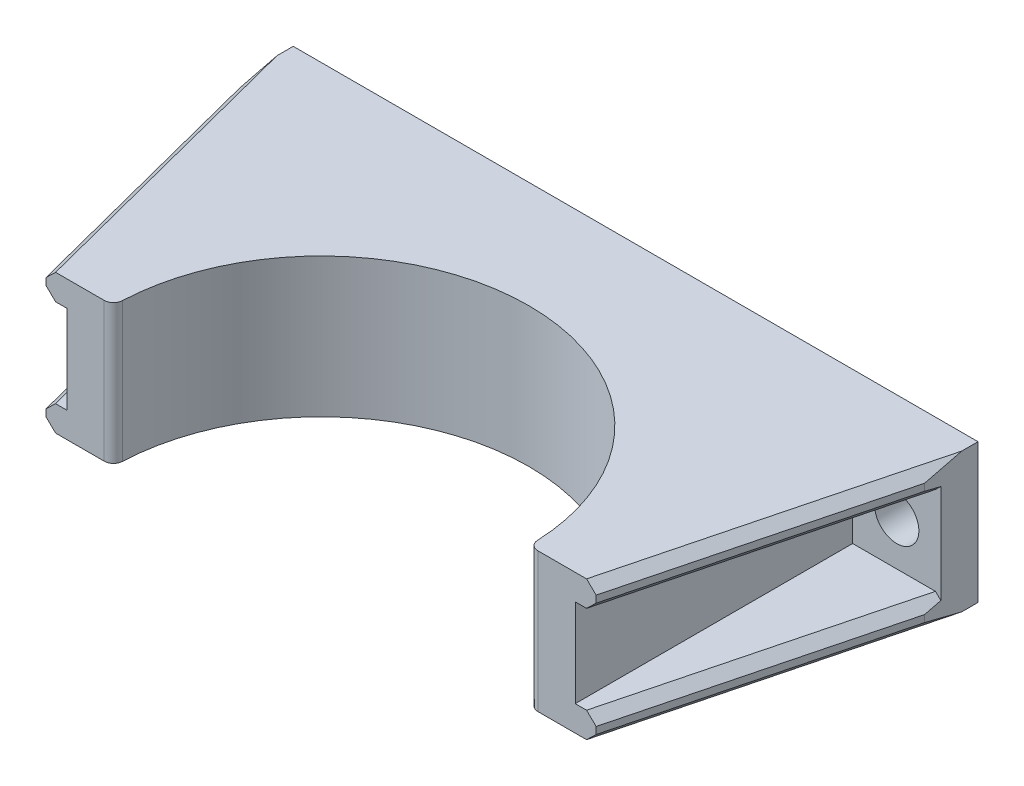
ISO-10303-21;
HEADER;
FILE_DESCRIPTION(('STEP AP214'),'2;1');
FILE_NAME('part.step','',(''),(''),'','','');
FILE_SCHEMA(('AUTOMOTIVE_DESIGN { 1 0 10303 214 1 1 1 1 }'));
ENDSEC;
DATA;
#1=APPLICATION_CONTEXT('core data for automotive mechanical design processes');
#2=APPLICATION_PROTOCOL_DEFINITION('international standard','automotive_design',2000,#1);
#3=PRODUCT_CONTEXT('',#1,'mechanical');
#4=PRODUCT('Part','Part','',(#3));
#5=PRODUCT_RELATED_PRODUCT_CATEGORY('part','',(#4));
#6=PRODUCT_DEFINITION_FORMATION('','',#4);
#7=PRODUCT_DEFINITION_CONTEXT('part definition',#1,'design');
#8=PRODUCT_DEFINITION('design','',#6,#7);
#9=PRODUCT_DEFINITION_SHAPE('','',#8);
#10=(LENGTH_UNIT() NAMED_UNIT(*) SI_UNIT(.MILLI.,.METRE.));
#11=(NAMED_UNIT(*) PLANE_ANGLE_UNIT() SI_UNIT($,.RADIAN.));
#12=(NAMED_UNIT(*) SI_UNIT($,.STERADIAN.) SOLID_ANGLE_UNIT());
#13=UNCERTAINTY_MEASURE_WITH_UNIT(LENGTH_MEASURE(1.E-05),#10,'distance_accuracy_value','');
#14=(GEOMETRIC_REPRESENTATION_CONTEXT(3) GLOBAL_UNCERTAINTY_ASSIGNED_CONTEXT((#13)) GLOBAL_UNIT_ASSIGNED_CONTEXT((#10,
#11,#12)) REPRESENTATION_CONTEXT('',''));
#15=CARTESIAN_POINT('',(0.,0.,0.));
#16=DIRECTION('',(0.,0.,1.));
#17=DIRECTION('',(1.,0.,0.));
#18=AXIS2_PLACEMENT_3D('',#15,#16,#17);
#19=CARTESIAN_POINT('',(54.75,30.,11.5));
#20=DIRECTION('',(-1.,0.,0.));
#21=DIRECTION('',(0.,0.,1.));
#22=AXIS2_PLACEMENT_3D('',#19,#20,#21);
#23=PLANE('',#22);
#24=DIRECTION('',(0.,0.,-1.));
#25=VECTOR('',#24,1.);
#26=CARTESIAN_POINT('',(54.75,5.49999999999998,76.0300404448525));
#27=LINE('',#26,#25);
#28=CARTESIAN_POINT('',(54.75,5.49999999999998,56.25));
#29=VERTEX_POINT('',#28);
#30=CARTESIAN_POINT('',(54.75,5.49999999999998,-3.5));
#31=VERTEX_POINT('',#30);
#32=EDGE_CURVE('E353',#29,#31,#27,.T.);
#33=ORIENTED_EDGE('',*,*,#32,.T.);
#34=DIRECTION('',(0.,-1.,0.));
#35=VECTOR('',#34,1.);
#36=CARTESIAN_POINT('',(54.75,30.,-3.5));
#37=LINE('',#36,#35);
#38=CARTESIAN_POINT('',(54.75,24.5,-3.50000000000001));
#39=VERTEX_POINT('',#38);
#40=EDGE_CURVE('E254',#39,#31,#37,.T.);
#41=ORIENTED_EDGE('',*,*,#40,.F.);
#42=DIRECTION('',(0.,0.,-1.));
#43=VECTOR('',#42,1.);
#44=CARTESIAN_POINT('',(54.75,24.5,76.0300404448525));
#45=LINE('',#44,#43);
#46=CARTESIAN_POINT('',(54.75,24.5,56.25));
#47=VERTEX_POINT('',#46);
#48=EDGE_CURVE('E239',#47,#39,#45,.T.);
#49=ORIENTED_EDGE('',*,*,#48,.F.);
#50=DIRECTION('',(0.,-1.,0.));
#51=VECTOR('',#50,1.);
#52=CARTESIAN_POINT('',(54.75,30.,56.25));
#53=LINE('',#52,#51);
#54=EDGE_CURVE('E251',#47,#29,#53,.T.);
#55=ORIENTED_EDGE('',*,*,#54,.T.);
#56=EDGE_LOOP('',(#33,#41,#49,#55));
#57=FACE_BOUND('',#56,.T.);
#58=ADVANCED_FACE('F47',(#57),#23,.F.);
#59=CARTESIAN_POINT('',(54.75,30.,-3.5));
#60=DIRECTION('',(0.,0.,-1.));
#61=DIRECTION('',(-1.,0.,0.));
#62=AXIS2_PLACEMENT_3D('',#59,#60,#61);
#63=PLANE('',#62);
#64=CARTESIAN_POINT('',(64.25,15.,-3.5));
#65=DIRECTION('',(0.,0.,-1.));
#66=DIRECTION('',(-1.,0.,0.));
#67=AXIS2_PLACEMENT_3D('',#64,#65,#66);
#68=CIRCLE('',#67,4.7625);
#69=CARTESIAN_POINT('',(59.4875,15.,-3.5));
#70=VERTEX_POINT('',#69);
#71=EDGE_CURVE('E286',#70,#70,#68,.T.);
#72=ORIENTED_EDGE('',*,*,#71,.T.);
#73=EDGE_LOOP('',(#72));
#74=FACE_BOUND('',#73,.T.);
#75=DIRECTION('',(-1.,0.,0.));
#76=VECTOR('',#75,1.);
#77=CARTESIAN_POINT('',(73.75,5.49999999999998,-3.50000000000001));
#78=LINE('',#77,#76);
#79=CARTESIAN_POINT('',(72.5868414992406,5.49999999999998,-3.50000000000001));
#80=VERTEX_POINT('',#79);
#81=EDGE_CURVE('E246',#80,#31,#78,.T.);
#82=ORIENTED_EDGE('',*,*,#81,.F.);
#83=DIRECTION('',(-0.718385797448398,0.695644913748695,0.));
#84=VECTOR('',#83,1.);
#85=CARTESIAN_POINT('',(51.1379723260028,26.269893835625,-3.5));
#86=LINE('',#85,#84);
#87=CARTESIAN_POINT('',(73.75,4.37366189892556,-3.5));
#88=VERTEX_POINT('',#87);
#89=EDGE_CURVE('E410',#80,#88,#86,.F.);
#90=ORIENTED_EDGE('',*,*,#89,.T.);
#91=DIRECTION('',(0.,-1.,0.));
#92=VECTOR('',#91,1.);
#93=CARTESIAN_POINT('',(73.75,30.,-3.5));
#94=LINE('',#93,#92);
#95=CARTESIAN_POINT('',(73.75,25.6263381010744,-3.5));
#96=VERTEX_POINT('',#95);
#97=EDGE_CURVE('E271',#96,#88,#94,.T.);
#98=ORIENTED_EDGE('',*,*,#97,.F.);
#99=DIRECTION('',(0.718385797448397,0.695644913748696,0.));
#100=VECTOR('',#99,1.);
#101=CARTESIAN_POINT('',(66.1302151091312,18.2477615451079,-3.5));
#102=LINE('',#101,#100);
#103=CARTESIAN_POINT('',(72.5868414992406,24.5,-3.50000000000001));
#104=VERTEX_POINT('',#103);
#105=EDGE_CURVE('E494',#96,#104,#102,.F.);
#106=ORIENTED_EDGE('',*,*,#105,.T.);
#107=DIRECTION('',(1.,0.,0.));
#108=VECTOR('',#107,1.);
#109=CARTESIAN_POINT('',(73.75,24.5,-3.50000000000001));
#110=LINE('',#109,#108);
#111=EDGE_CURVE('E256',#39,#104,#110,.T.);
#112=ORIENTED_EDGE('',*,*,#111,.F.);
#113=ORIENTED_EDGE('',*,*,#40,.T.);
#114=EDGE_LOOP('',(#82,#90,#98,#106,#112,#113));
#115=FACE_BOUND('',#114,.T.);
#116=ADVANCED_FACE('F403',(#74,#115),#63,.F.);
#117=CARTESIAN_POINT('',(-54.75,30.,-3.5));
#118=DIRECTION('',(0.,0.,-1.));
#119=DIRECTION('',(-1.,0.,0.));
#120=AXIS2_PLACEMENT_3D('',#117,#118,#119);
#121=PLANE('',#120);
#122=CARTESIAN_POINT('',(-64.25,15.,-3.5));
#123=DIRECTION('',(0.,0.,-1.));
#124=DIRECTION('',(-1.,0.,0.));
#125=AXIS2_PLACEMENT_3D('',#122,#123,#124);
#126=CIRCLE('',#125,4.7625);
#127=CARTESIAN_POINT('',(-69.0125,15.,-3.5));
#128=VERTEX_POINT('',#127);
#129=EDGE_CURVE('E290',#128,#128,#126,.T.);
#130=ORIENTED_EDGE('',*,*,#129,.T.);
#131=EDGE_LOOP('',(#130));
#132=FACE_BOUND('',#131,.T.);
#133=DIRECTION('',(-1.,0.,0.));
#134=VECTOR('',#133,1.);
#135=CARTESIAN_POINT('',(-73.75,5.49999999999999,-3.50000000000001));
#136=LINE('',#135,#134);
#137=CARTESIAN_POINT('',(-54.75,5.49999999999999,-3.5));
#138=VERTEX_POINT('',#137);
#139=CARTESIAN_POINT('',(-72.5868414992405,5.49999999999999,-3.50000000000001));
#140=VERTEX_POINT('',#139);
#141=EDGE_CURVE('E370',#138,#140,#136,.T.);
#142=ORIENTED_EDGE('',*,*,#141,.F.);
#143=DIRECTION('',(0.,-1.,0.));
#144=VECTOR('',#143,1.);
#145=CARTESIAN_POINT('',(-54.75,30.,-3.5));
#146=LINE('',#145,#144);
#147=CARTESIAN_POINT('',(-54.75,24.5,-3.50000000000001));
#148=VERTEX_POINT('',#147);
#149=EDGE_CURVE('E269',#148,#138,#146,.T.);
#150=ORIENTED_EDGE('',*,*,#149,.F.);
#151=DIRECTION('',(1.,0.,0.));
#152=VECTOR('',#151,1.);
#153=CARTESIAN_POINT('',(-73.75,24.5,-3.50000000000001));
#154=LINE('',#153,#152);
#155=CARTESIAN_POINT('',(-72.5868414992405,24.5,-3.50000000000001));
#156=VERTEX_POINT('',#155);
#157=EDGE_CURVE('E374',#156,#148,#154,.T.);
#158=ORIENTED_EDGE('',*,*,#157,.F.);
#159=DIRECTION('',(0.718385797448395,-0.695644913748697,0.));
#160=VECTOR('',#159,1.);
#161=CARTESIAN_POINT('',(-66.1302151091312,18.2477615451079,-3.5));
#162=LINE('',#161,#160);
#163=CARTESIAN_POINT('',(-73.75,25.6263381010744,-3.5));
#164=VERTEX_POINT('',#163);
#165=EDGE_CURVE('E502',#156,#164,#162,.F.);
#166=ORIENTED_EDGE('',*,*,#165,.T.);
#167=DIRECTION('',(0.,-1.,0.));
#168=VECTOR('',#167,1.);
#169=CARTESIAN_POINT('',(-73.75,30.,-3.5));
#170=LINE('',#169,#168);
#171=CARTESIAN_POINT('',(-73.75,4.37366189892556,-3.5));
#172=VERTEX_POINT('',#171);
#173=EDGE_CURVE('E278',#164,#172,#170,.T.);
#174=ORIENTED_EDGE('',*,*,#173,.T.);
#175=DIRECTION('',(-0.7183857974484,-0.695644913748693,0.));
#176=VECTOR('',#175,1.);
#177=CARTESIAN_POINT('',(-51.1379723260028,26.2698938356249,-3.5));
#178=LINE('',#177,#176);
#179=EDGE_CURVE('E499',#172,#140,#178,.F.);
#180=ORIENTED_EDGE('',*,*,#179,.T.);
#181=EDGE_LOOP('',(#142,#150,#158,#166,#174,#180));
#182=FACE_BOUND('',#181,.T.);
#183=ADVANCED_FACE('F406',(#132,#182),#121,.F.);
#184=CARTESIAN_POINT('',(-54.75,30.,11.5));
#185=DIRECTION('',(1.,0.,0.));
#186=DIRECTION('',(0.,0.,-1.));
#187=AXIS2_PLACEMENT_3D('',#184,#185,#186);
#188=PLANE('',#187);
#189=DIRECTION('',(0.,0.,-1.));
#190=VECTOR('',#189,1.);
#191=CARTESIAN_POINT('',(-54.75,5.49999999999999,76.0300404448525));
#192=LINE('',#191,#190);
#193=CARTESIAN_POINT('',(-54.75,5.49999999999999,56.25));
#194=VERTEX_POINT('',#193);
#195=EDGE_CURVE('E366',#194,#138,#192,.T.);
#196=ORIENTED_EDGE('',*,*,#195,.F.);
#197=DIRECTION('',(0.,-1.,0.));
#198=VECTOR('',#197,1.);
#199=CARTESIAN_POINT('',(-54.75,30.,56.25));
#200=LINE('',#199,#198);
#201=CARTESIAN_POINT('',(-54.75,24.5,56.25));
#202=VERTEX_POINT('',#201);
#203=EDGE_CURVE('E264',#202,#194,#200,.T.);
#204=ORIENTED_EDGE('',*,*,#203,.F.);
#205=DIRECTION('',(0.,0.,-1.));
#206=VECTOR('',#205,1.);
#207=CARTESIAN_POINT('',(-54.75,24.5,76.0300404448525));
#208=LINE('',#207,#206);
#209=EDGE_CURVE('E380',#202,#148,#208,.T.);
#210=ORIENTED_EDGE('',*,*,#209,.T.);
#211=ORIENTED_EDGE('',*,*,#149,.T.);
#212=EDGE_LOOP('',(#196,#204,#210,#211));
#213=FACE_BOUND('',#212,.T.);
#214=ADVANCED_FACE('F637',(#213),#188,.F.);
#215=CARTESIAN_POINT('',(-54.75,30.,-11.5));
#216=DIRECTION('',(0.,0.,1.));
#217=DIRECTION('',(1.,0.,0.));
#218=AXIS2_PLACEMENT_3D('',#215,#216,#217);
#219=PLANE('',#218);
#220=CARTESIAN_POINT('',(-64.25,15.,-11.5));
#221=DIRECTION('',(0.,0.,1.));
#222=DIRECTION('',(1.,0.,0.));
#223=AXIS2_PLACEMENT_3D('',#220,#221,#222);
#224=CIRCLE('',#223,4.7625);
#225=CARTESIAN_POINT('',(-59.4875,15.,-11.5));
#226=VERTEX_POINT('',#225);
#227=EDGE_CURVE('E291',#226,#226,#224,.T.);
#228=ORIENTED_EDGE('',*,*,#227,.T.);
#229=EDGE_LOOP('',(#228));
#230=FACE_BOUND('',#229,.T.);
#231=CARTESIAN_POINT('',(64.25,15.,-11.5));
#232=DIRECTION('',(0.,0.,1.));
#233=DIRECTION('',(1.,0.,0.));
#234=AXIS2_PLACEMENT_3D('',#231,#232,#233);
#235=CIRCLE('',#234,4.7625);
#236=CARTESIAN_POINT('',(69.0125,15.,-11.5));
#237=VERTEX_POINT('',#236);
#238=EDGE_CURVE('E379',#237,#237,#235,.T.);
#239=ORIENTED_EDGE('',*,*,#238,.T.);
#240=EDGE_LOOP('',(#239));
#241=FACE_BOUND('',#240,.T.);
#242=DIRECTION('',(-1.,0.,0.));
#243=VECTOR('',#242,1.);
#244=CARTESIAN_POINT('',(-54.75,0.,-11.5));
#245=LINE('',#244,#243);
#246=CARTESIAN_POINT('',(73.75,0.,-11.5));
#247=VERTEX_POINT('',#246);
#248=CARTESIAN_POINT('',(-73.75,0.,-11.5));
#249=VERTEX_POINT('',#248);
#250=EDGE_CURVE('E295',#247,#249,#245,.T.);
#251=ORIENTED_EDGE('',*,*,#250,.T.);
#252=DIRECTION('',(0.,-1.,0.));
#253=VECTOR('',#252,1.);
#254=CARTESIAN_POINT('',(-73.75,30.,-11.5));
#255=LINE('',#254,#253);
#256=CARTESIAN_POINT('',(-73.75,30.,-11.5));
#257=VERTEX_POINT('',#256);
#258=EDGE_CURVE('E281',#257,#249,#255,.T.);
#259=ORIENTED_EDGE('',*,*,#258,.F.);
#260=DIRECTION('',(-1.,0.,0.));
#261=VECTOR('',#260,1.);
#262=CARTESIAN_POINT('',(54.75,30.,-11.5));
#263=LINE('',#262,#261);
#264=CARTESIAN_POINT('',(73.75,30.,-11.5));
#265=VERTEX_POINT('',#264);
#266=EDGE_CURVE('E302',#265,#257,#263,.T.);
#267=ORIENTED_EDGE('',*,*,#266,.F.);
#268=DIRECTION('',(0.,-1.,0.));
#269=VECTOR('',#268,1.);
#270=CARTESIAN_POINT('',(73.75,30.,-11.5));
#271=LINE('',#270,#269);
#272=EDGE_CURVE('E326',#265,#247,#271,.T.);
#273=ORIENTED_EDGE('',*,*,#272,.T.);
#274=EDGE_LOOP('',(#251,#259,#267,#273));
#275=FACE_BOUND('',#274,.T.);
#276=ADVANCED_FACE('F392',(#230,#241,#275),#219,.F.);
#277=CARTESIAN_POINT('',(-73.75,30.,-11.5));
#278=DIRECTION('',(1.,0.,0.));
#279=DIRECTION('',(0.,0.,-1.));
#280=AXIS2_PLACEMENT_3D('',#277,#278,#279);
#281=PLANE('',#280);
#282=DIRECTION('',(0.,0.,1.));
#283=VECTOR('',#282,1.);
#284=CARTESIAN_POINT('',(-73.75,0.,-11.5));
#285=LINE('',#284,#283);
#286=CARTESIAN_POINT('',(-73.75,0.,-8.01225280467029));
#287=VERTEX_POINT('',#286);
#288=EDGE_CURVE('E548',#249,#287,#285,.T.);
#289=ORIENTED_EDGE('',*,*,#288,.T.);
#290=DIRECTION('',(0.,-0.24218649594084,-0.970229715677632));
#291=VECTOR('',#290,1.);
#292=CARTESIAN_POINT('',(-73.75,18.348068680973,65.4924295700345));
#293=LINE('',#292,#291);
#294=CARTESIAN_POINT('',(-73.75,2.,0.));
#295=VERTEX_POINT('',#294);
#296=EDGE_CURVE('E458',#287,#295,#293,.F.);
#297=ORIENTED_EDGE('',*,*,#296,.T.);
#298=DIRECTION('',(0.,1.,0.));
#299=VECTOR('',#298,1.);
#300=CARTESIAN_POINT('',(-73.75,0.,0.));
#301=LINE('',#300,#299);
#302=CARTESIAN_POINT('',(-73.75,3.49999999999999,0.));
#303=VERTEX_POINT('',#302);
#304=EDGE_CURVE('E359',#295,#303,#301,.T.);
#305=ORIENTED_EDGE('',*,*,#304,.T.);
#306=DIRECTION('',(0.,-0.24218649594084,0.970229715677632));
#307=VECTOR('',#306,1.);
#308=CARTESIAN_POINT('',(-73.75,-13.0174910215977,66.1711568819563));
#309=LINE('',#308,#307);
#310=EDGE_CURVE('E454',#303,#172,#309,.F.);
#311=ORIENTED_EDGE('',*,*,#310,.T.);
#312=ORIENTED_EDGE('',*,*,#173,.F.);
#313=DIRECTION('',(0.,-0.242186495940843,-0.970229715677631));
#314=VECTOR('',#313,1.);
#315=CARTESIAN_POINT('',(-73.75,43.0174910215979,66.1711568819562));
#316=LINE('',#315,#314);
#317=CARTESIAN_POINT('',(-73.75,26.5,0.));
#318=VERTEX_POINT('',#317);
#319=EDGE_CURVE('E451',#164,#318,#316,.F.);
#320=ORIENTED_EDGE('',*,*,#319,.T.);
#321=CARTESIAN_POINT('',(-73.75,28.,0.));
#322=VERTEX_POINT('',#321);
#323=EDGE_CURVE('E444',#318,#322,#301,.T.);
#324=ORIENTED_EDGE('',*,*,#323,.T.);
#325=DIRECTION('',(0.,0.242186495940841,-0.970229715677631));
#326=VECTOR('',#325,1.);
#327=CARTESIAN_POINT('',(-73.75,14.7825699007575,52.9506956915942));
#328=LINE('',#327,#326);
#329=CARTESIAN_POINT('',(-73.75,30.,-8.0122528046702));
#330=VERTEX_POINT('',#329);
#331=EDGE_CURVE('E440',#322,#330,#328,.T.);
#332=ORIENTED_EDGE('',*,*,#331,.T.);
#333=DIRECTION('',(0.,0.,1.));
#334=VECTOR('',#333,1.);
#335=CARTESIAN_POINT('',(-73.75,30.,-11.5));
#336=LINE('',#335,#334);
#337=EDGE_CURVE('E296',#257,#330,#336,.T.);
#338=ORIENTED_EDGE('',*,*,#337,.F.);
#339=ORIENTED_EDGE('',*,*,#258,.T.);
#340=EDGE_LOOP('',(#289,#297,#305,#311,#312,#320,#324,#332,#338,#339));
#341=FACE_BOUND('',#340,.T.);
#342=ADVANCED_FACE('F636',(#341),#281,.F.);
#343=CARTESIAN_POINT('',(-54.75,30.,56.25));
#344=DIRECTION('',(0.,0.,-1.));
#345=DIRECTION('',(-1.,0.,0.));
#346=AXIS2_PLACEMENT_3D('',#343,#344,#345);
#347=PLANE('',#346);
#348=DIRECTION('',(1.,0.,0.));
#349=VECTOR('',#348,1.);
#350=CARTESIAN_POINT('',(-54.75,0.,56.25));
#351=LINE('',#350,#349);
#352=CARTESIAN_POINT('',(-57.1846192770183,0.,56.25));
#353=VERTEX_POINT('',#352);
#354=CARTESIAN_POINT('',(-46.7071996591532,0.,56.25));
#355=VERTEX_POINT('',#354);
#356=EDGE_CURVE('E542',#353,#355,#351,.T.);
#357=ORIENTED_EDGE('',*,*,#356,.T.);
#358=DIRECTION('',(0.,-1.,0.));
#359=VECTOR('',#358,1.);
#360=CARTESIAN_POINT('',(-46.7071996591532,30.,56.25));
#361=LINE('',#360,#359);
#362=CARTESIAN_POINT('',(-46.7071996591532,30.,56.25));
#363=VERTEX_POINT('',#362);
#364=EDGE_CURVE('E11',#355,#363,#361,.F.);
#365=ORIENTED_EDGE('',*,*,#364,.T.);
#366=DIRECTION('',(1.,0.,0.));
#367=VECTOR('',#366,1.);
#368=CARTESIAN_POINT('',(-54.75,30.,56.25));
#369=LINE('',#368,#367);
#370=CARTESIAN_POINT('',(-57.1846192770183,30.,56.25));
#371=VERTEX_POINT('',#370);
#372=EDGE_CURVE('E301',#371,#363,#369,.T.);
#373=ORIENTED_EDGE('',*,*,#372,.F.);
#374=DIRECTION('',(-0.718385797448398,-0.695644913748695,0.));
#375=VECTOR('',#374,1.);
#376=CARTESIAN_POINT('',(-59.25,28.,56.25));
#377=LINE('',#376,#375);
#378=CARTESIAN_POINT('',(-59.25,28.,56.25));
#379=VERTEX_POINT('',#378);
#380=EDGE_CURVE('E467',#371,#379,#377,.T.);
#381=ORIENTED_EDGE('',*,*,#380,.T.);
#382=DIRECTION('',(0.,1.,0.));
#383=VECTOR('',#382,1.);
#384=CARTESIAN_POINT('',(-59.25,0.,56.25));
#385=LINE('',#384,#383);
#386=CARTESIAN_POINT('',(-59.25,26.5,56.25));
#387=VERTEX_POINT('',#386);
#388=EDGE_CURVE('E340',#387,#379,#385,.T.);
#389=ORIENTED_EDGE('',*,*,#388,.F.);
#390=DIRECTION('',(-0.718385797448395,0.695644913748697,0.));
#391=VECTOR('',#390,1.);
#392=CARTESIAN_POINT('',(-55.2498534994626,22.6264802600049,56.25));
#393=LINE('',#392,#391);
#394=CARTESIAN_POINT('',(-57.1846192770183,24.5,56.25));
#395=VERTEX_POINT('',#394);
#396=EDGE_CURVE('E470',#387,#395,#393,.F.);
#397=ORIENTED_EDGE('',*,*,#396,.T.);
#398=DIRECTION('',(-1.,0.,0.));
#399=VECTOR('',#398,1.);
#400=CARTESIAN_POINT('',(-73.75,24.5,56.25));
#401=LINE('',#400,#399);
#402=EDGE_CURVE('E375',#202,#395,#401,.T.);
#403=ORIENTED_EDGE('',*,*,#402,.F.);
#404=ORIENTED_EDGE('',*,*,#203,.T.);
#405=DIRECTION('',(1.,0.,0.));
#406=VECTOR('',#405,1.);
#407=CARTESIAN_POINT('',(-73.75,5.49999999999999,56.25));
#408=LINE('',#407,#406);
#409=CARTESIAN_POINT('',(-57.1846192770183,5.49999999999999,56.25));
#410=VERTEX_POINT('',#409);
#411=EDGE_CURVE('E363',#410,#194,#408,.T.);
#412=ORIENTED_EDGE('',*,*,#411,.F.);
#413=DIRECTION('',(0.7183857974484,0.695644913748693,0.));
#414=VECTOR('',#413,1.);
#415=CARTESIAN_POINT('',(-55.2498534994626,7.37351973999508,56.25));
#416=LINE('',#415,#414);
#417=CARTESIAN_POINT('',(-59.25,3.49999999999999,56.25));
#418=VERTEX_POINT('',#417);
#419=EDGE_CURVE('E473',#410,#418,#416,.F.);
#420=ORIENTED_EDGE('',*,*,#419,.T.);
#421=CARTESIAN_POINT('',(-59.25,2.,56.25));
#422=VERTEX_POINT('',#421);
#423=EDGE_CURVE('E448',#422,#418,#385,.T.);
#424=ORIENTED_EDGE('',*,*,#423,.F.);
#425=DIRECTION('',(-0.7183857974484,0.695644913748692,0.));
#426=VECTOR('',#425,1.);
#427=CARTESIAN_POINT('',(-55.3457730494781,-1.78063657424436,56.25));
#428=LINE('',#427,#426);
#429=EDGE_CURVE('E476',#422,#353,#428,.F.);
#430=ORIENTED_EDGE('',*,*,#429,.T.);
#431=EDGE_LOOP('',(#357,#365,#373,#381,#389,#397,#403,#404,#412,#420,#424,#430));
#432=FACE_BOUND('',#431,.T.);
#433=ADVANCED_FACE('F633',(#432),#347,.F.);
#434=CARTESIAN_POINT('',(0.,30.,56.25));
#435=DIRECTION('',(0.,-1.,0.));
#436=DIRECTION('',(0.,0.,-1.));
#437=AXIS2_PLACEMENT_3D('',#434,#435,#436);
#438=CYLINDRICAL_SURFACE('',#437,44.75);
#439=CARTESIAN_POINT('',(0.,0.,56.25));
#440=DIRECTION('',(0.,-1.,0.));
#441=DIRECTION('',(0.,0.,1.));
#442=AXIS2_PLACEMENT_3D('',#439,#440,#441);
#443=CIRCLE('',#442,44.75);
#444=CARTESIAN_POINT('',(-44.7090306897776,0.,54.3355614973262));
#445=VERTEX_POINT('',#444);
#446=CARTESIAN_POINT('',(44.7090306897777,0.,54.3355614973262));
#447=VERTEX_POINT('',#446);
#448=EDGE_CURVE('E537',#445,#447,#443,.T.);
#449=ORIENTED_EDGE('',*,*,#448,.T.);
#450=DIRECTION('',(0.,-1.,0.));
#451=VECTOR('',#450,1.);
#452=CARTESIAN_POINT('',(44.7090306897777,30.,54.3355614973262));
#453=LINE('',#452,#451);
#454=CARTESIAN_POINT('',(44.7090306897777,30.,54.3355614973262));
#455=VERTEX_POINT('',#454);
#456=EDGE_CURVE('E69',#447,#455,#453,.F.);
#457=ORIENTED_EDGE('',*,*,#456,.T.);
#458=CARTESIAN_POINT('',(0.,30.,56.25));
#459=DIRECTION('',(0.,-1.,0.));
#460=DIRECTION('',(0.,0.,1.));
#461=AXIS2_PLACEMENT_3D('',#458,#459,#460);
#462=CIRCLE('',#461,44.75);
#463=CARTESIAN_POINT('',(-44.7090306897776,30.,54.3355614973262));
#464=VERTEX_POINT('',#463);
#465=EDGE_CURVE('E312',#464,#455,#462,.T.);
#466=ORIENTED_EDGE('',*,*,#465,.F.);
#467=DIRECTION('',(0.,-1.,0.));
#468=VECTOR('',#467,1.);
#469=CARTESIAN_POINT('',(-44.7090306897776,30.,54.3355614973262));
#470=LINE('',#469,#468);
#471=EDGE_CURVE('E516',#464,#445,#470,.T.);
#472=ORIENTED_EDGE('',*,*,#471,.T.);
#473=EDGE_LOOP('',(#449,#457,#466,#472));
#474=FACE_BOUND('',#473,.T.);
#475=ADVANCED_FACE('F539',(#474),#438,.F.);
#476=CARTESIAN_POINT('',(44.75,30.,56.25));
#477=DIRECTION('',(0.,0.,-1.));
#478=DIRECTION('',(-1.,0.,0.));
#479=AXIS2_PLACEMENT_3D('',#476,#477,#478);
#480=PLANE('',#479);
#481=DIRECTION('',(1.,0.,0.));
#482=VECTOR('',#481,1.);
#483=CARTESIAN_POINT('',(44.75,30.,56.25));
#484=LINE('',#483,#482);
#485=CARTESIAN_POINT('',(46.7071996591532,30.,56.25));
#486=VERTEX_POINT('',#485);
#487=CARTESIAN_POINT('',(57.1846192770184,30.,56.25));
#488=VERTEX_POINT('',#487);
#489=EDGE_CURVE('E315',#486,#488,#484,.T.);
#490=ORIENTED_EDGE('',*,*,#489,.F.);
#491=DIRECTION('',(0.,-1.,0.));
#492=VECTOR('',#491,1.);
#493=CARTESIAN_POINT('',(46.7071996591532,30.,56.25));
#494=LINE('',#493,#492);
#495=CARTESIAN_POINT('',(46.7071996591532,0.,56.25));
#496=VERTEX_POINT('',#495);
#497=EDGE_CURVE('E506',#486,#496,#494,.T.);
#498=ORIENTED_EDGE('',*,*,#497,.T.);
#499=DIRECTION('',(1.,0.,0.));
#500=VECTOR('',#499,1.);
#501=CARTESIAN_POINT('',(44.75,0.,56.25));
#502=LINE('',#501,#500);
#503=CARTESIAN_POINT('',(57.1846192770184,0.,56.25));
#504=VERTEX_POINT('',#503);
#505=EDGE_CURVE('E538',#496,#504,#502,.T.);
#506=ORIENTED_EDGE('',*,*,#505,.T.);
#507=DIRECTION('',(-0.718385797448399,-0.695644913748694,0.));
#508=VECTOR('',#507,1.);
#509=CARTESIAN_POINT('',(55.3457730494781,-1.78063657424436,56.25));
#510=LINE('',#509,#508);
#511=CARTESIAN_POINT('',(59.25,2.,56.25));
#512=VERTEX_POINT('',#511);
#513=EDGE_CURVE('E575',#504,#512,#510,.F.);
#514=ORIENTED_EDGE('',*,*,#513,.T.);
#515=DIRECTION('',(0.,1.,0.));
#516=VECTOR('',#515,1.);
#517=CARTESIAN_POINT('',(59.25,0.,56.25));
#518=LINE('',#517,#516);
#519=CARTESIAN_POINT('',(59.25,3.49999999999999,56.25));
#520=VERTEX_POINT('',#519);
#521=EDGE_CURVE('E347',#512,#520,#518,.T.);
#522=ORIENTED_EDGE('',*,*,#521,.T.);
#523=DIRECTION('',(0.718385797448398,-0.695644913748695,0.));
#524=VECTOR('',#523,1.);
#525=CARTESIAN_POINT('',(55.2498534994626,7.37351973999507,56.25));
#526=LINE('',#525,#524);
#527=CARTESIAN_POINT('',(57.1846192770184,5.49999999999998,56.25));
#528=VERTEX_POINT('',#527);
#529=EDGE_CURVE('E572',#520,#528,#526,.F.);
#530=ORIENTED_EDGE('',*,*,#529,.T.);
#531=DIRECTION('',(1.,0.,0.));
#532=VECTOR('',#531,1.);
#533=CARTESIAN_POINT('',(73.75,5.49999999999998,56.25));
#534=LINE('',#533,#532);
#535=EDGE_CURVE('E261',#29,#528,#534,.T.);
#536=ORIENTED_EDGE('',*,*,#535,.F.);
#537=ORIENTED_EDGE('',*,*,#54,.F.);
#538=DIRECTION('',(-1.,0.,0.));
#539=VECTOR('',#538,1.);
#540=CARTESIAN_POINT('',(73.75,24.5,56.25));
#541=LINE('',#540,#539);
#542=CARTESIAN_POINT('',(57.1846192770184,24.5,56.25));
#543=VERTEX_POINT('',#542);
#544=EDGE_CURVE('E235',#543,#47,#541,.T.);
#545=ORIENTED_EDGE('',*,*,#544,.F.);
#546=DIRECTION('',(-0.718385797448397,-0.695644913748696,0.));
#547=VECTOR('',#546,1.);
#548=CARTESIAN_POINT('',(55.2498534994627,22.6264802600049,56.25));
#549=LINE('',#548,#547);
#550=CARTESIAN_POINT('',(59.25,26.5,56.25));
#551=VERTEX_POINT('',#550);
#552=EDGE_CURVE('E569',#543,#551,#549,.F.);
#553=ORIENTED_EDGE('',*,*,#552,.T.);
#554=CARTESIAN_POINT('',(59.25,28.,56.25));
#555=VERTEX_POINT('',#554);
#556=EDGE_CURVE('E352',#551,#555,#518,.T.);
#557=ORIENTED_EDGE('',*,*,#556,.T.);
#558=DIRECTION('',(-0.718385797448395,0.695644913748698,0.));
#559=VECTOR('',#558,1.);
#560=CARTESIAN_POINT('',(59.25,28.,56.25));
#561=LINE('',#560,#559);
#562=EDGE_CURVE('E327',#555,#488,#561,.T.);
#563=ORIENTED_EDGE('',*,*,#562,.T.);
#564=EDGE_LOOP('',(#490,#498,#506,#514,#522,#530,#536,#537,#545,#553,#557,#563));
#565=FACE_BOUND('',#564,.T.);
#566=ADVANCED_FACE('F259',(#565),#480,.F.);
#567=CARTESIAN_POINT('',(73.75,30.,-11.5));
#568=DIRECTION('',(-1.,0.,0.));
#569=DIRECTION('',(0.,0.,1.));
#570=AXIS2_PLACEMENT_3D('',#567,#568,#569);
#571=PLANE('',#570);
#572=DIRECTION('',(0.,0.,-1.));
#573=VECTOR('',#572,1.);
#574=CARTESIAN_POINT('',(73.75,30.,-11.5));
#575=LINE('',#574,#573);
#576=CARTESIAN_POINT('',(73.75,30.,-8.01225280467014));
#577=VERTEX_POINT('',#576);
#578=EDGE_CURVE('E318',#577,#265,#575,.T.);
#579=ORIENTED_EDGE('',*,*,#578,.F.);
#580=DIRECTION('',(0.,-0.242186495940845,0.97022971567763));
#581=VECTOR('',#580,1.);
#582=CARTESIAN_POINT('',(73.7500000000001,14.7825699007574,52.9506956915941));
#583=LINE('',#582,#581);
#584=CARTESIAN_POINT('',(73.75,28.,0.));
#585=VERTEX_POINT('',#584);
#586=EDGE_CURVE('E426',#577,#585,#583,.T.);
#587=ORIENTED_EDGE('',*,*,#586,.T.);
#588=DIRECTION('',(0.,1.,0.));
#589=VECTOR('',#588,1.);
#590=CARTESIAN_POINT('',(73.75,0.,0.));
#591=LINE('',#590,#589);
#592=CARTESIAN_POINT('',(73.75,26.5,0.));
#593=VERTEX_POINT('',#592);
#594=EDGE_CURVE('E303',#593,#585,#591,.T.);
#595=ORIENTED_EDGE('',*,*,#594,.F.);
#596=DIRECTION('',(0.,0.242186495940843,0.97022971567763));
#597=VECTOR('',#596,1.);
#598=CARTESIAN_POINT('',(73.7500000000001,43.017491021598,66.1711568819562));
#599=LINE('',#598,#597);
#600=EDGE_CURVE('E564',#593,#96,#599,.F.);
#601=ORIENTED_EDGE('',*,*,#600,.T.);
#602=ORIENTED_EDGE('',*,*,#97,.T.);
#603=DIRECTION('',(0.,0.242186495940843,-0.970229715677631));
#604=VECTOR('',#603,1.);
#605=CARTESIAN_POINT('',(73.7500000000001,-13.0174910215979,66.1711568819562));
#606=LINE('',#605,#604);
#607=CARTESIAN_POINT('',(73.75,3.49999999999999,0.));
#608=VERTEX_POINT('',#607);
#609=EDGE_CURVE('E561',#88,#608,#606,.F.);
#610=ORIENTED_EDGE('',*,*,#609,.T.);
#611=CARTESIAN_POINT('',(73.75,2.,0.));
#612=VERTEX_POINT('',#611);
#613=EDGE_CURVE('E336',#612,#608,#591,.T.);
#614=ORIENTED_EDGE('',*,*,#613,.F.);
#615=DIRECTION('',(0.,0.242186495940842,0.970229715677631));
#616=VECTOR('',#615,1.);
#617=CARTESIAN_POINT('',(73.7500000000001,18.3480686809732,65.4924295700343));
#618=LINE('',#617,#616);
#619=CARTESIAN_POINT('',(73.75,0.,-8.01225280467028));
#620=VERTEX_POINT('',#619);
#621=EDGE_CURVE('E335',#612,#620,#618,.F.);
#622=ORIENTED_EDGE('',*,*,#621,.T.);
#623=DIRECTION('',(0.,0.,-1.));
#624=VECTOR('',#623,1.);
#625=CARTESIAN_POINT('',(73.75,0.,-11.5));
#626=LINE('',#625,#624);
#627=EDGE_CURVE('E546',#620,#247,#626,.T.);
#628=ORIENTED_EDGE('',*,*,#627,.T.);
#629=ORIENTED_EDGE('',*,*,#272,.F.);
#630=EDGE_LOOP('',(#579,#587,#595,#601,#602,#610,#614,#622,#628,#629));
#631=FACE_BOUND('',#630,.T.);
#632=ADVANCED_FACE('F559',(#631),#571,.F.);
#633=CARTESIAN_POINT('',(0.,30.,56.25));
#634=DIRECTION('',(0.,1.,0.));
#635=DIRECTION('',(0.,0.,1.));
#636=AXIS2_PLACEMENT_3D('',#633,#634,#635);
#637=PLANE('',#636);
#638=ORIENTED_EDGE('',*,*,#465,.T.);
#639=CARTESIAN_POINT('',(46.7071996591532,30.,54.25));
#640=DIRECTION('',(0.,1.,0.));
#641=DIRECTION('',(0.,0.,1.));
#642=AXIS2_PLACEMENT_3D('',#639,#640,#641);
#643=CIRCLE('',#642,2.);
#644=EDGE_CURVE('E56',#455,#486,#643,.T.);
#645=ORIENTED_EDGE('',*,*,#644,.T.);
#646=ORIENTED_EDGE('',*,*,#489,.T.);
#647=DIRECTION('',(0.24961768540731,0.,-0.968344469252496));
#648=VECTOR('',#647,1.);
#649=CARTESIAN_POINT('',(71.8133110614951,30.,-0.499235370814614));
#650=LINE('',#649,#648);
#651=EDGE_CURVE('E332',#488,#577,#650,.T.);
#652=ORIENTED_EDGE('',*,*,#651,.T.);
#653=ORIENTED_EDGE('',*,*,#578,.T.);
#654=ORIENTED_EDGE('',*,*,#266,.T.);
#655=ORIENTED_EDGE('',*,*,#337,.T.);
#656=DIRECTION('',(0.24961768540731,0.,0.968344469252496));
#657=VECTOR('',#656,1.);
#658=CARTESIAN_POINT('',(-57.313311061495,30.,55.7507646291854));
#659=LINE('',#658,#657);
#660=EDGE_CURVE('E329',#330,#371,#659,.T.);
#661=ORIENTED_EDGE('',*,*,#660,.T.);
#662=ORIENTED_EDGE('',*,*,#372,.T.);
#663=CARTESIAN_POINT('',(-46.7071996591532,30.,54.25));
#664=DIRECTION('',(0.,1.,0.));
#665=DIRECTION('',(0.,0.,1.));
#666=AXIS2_PLACEMENT_3D('',#663,#664,#665);
#667=CIRCLE('',#666,2.);
#668=EDGE_CURVE('E522',#363,#464,#667,.T.);
#669=ORIENTED_EDGE('',*,*,#668,.T.);
#670=EDGE_LOOP('',(#638,#645,#646,#652,#653,#654,#655,#661,#662,#669));
#671=FACE_BOUND('',#670,.T.);
#672=ADVANCED_FACE('F527',(#671),#637,.T.);
#673=CARTESIAN_POINT('',(0.,0.,56.25));
#674=DIRECTION('',(0.,1.,0.));
#675=DIRECTION('',(0.,0.,1.));
#676=AXIS2_PLACEMENT_3D('',#673,#674,#675);
#677=PLANE('',#676);
#678=ORIENTED_EDGE('',*,*,#505,.F.);
#679=CARTESIAN_POINT('',(46.7071996591532,0.,54.25));
#680=DIRECTION('',(0.,1.,0.));
#681=DIRECTION('',(0.,0.,1.));
#682=AXIS2_PLACEMENT_3D('',#679,#680,#681);
#683=CIRCLE('',#682,2.);
#684=EDGE_CURVE('E513',#496,#447,#683,.F.);
#685=ORIENTED_EDGE('',*,*,#684,.T.);
#686=ORIENTED_EDGE('',*,*,#448,.F.);
#687=CARTESIAN_POINT('',(-46.7071996591532,0.,54.25));
#688=DIRECTION('',(0.,1.,0.));
#689=DIRECTION('',(0.,0.,1.));
#690=AXIS2_PLACEMENT_3D('',#687,#688,#689);
#691=CIRCLE('',#690,2.);
#692=EDGE_CURVE('E510',#445,#355,#691,.F.);
#693=ORIENTED_EDGE('',*,*,#692,.T.);
#694=ORIENTED_EDGE('',*,*,#356,.F.);
#695=DIRECTION('',(-0.24961768540731,0.,-0.968344469252496));
#696=VECTOR('',#695,1.);
#697=CARTESIAN_POINT('',(-53.6215034710599,0.,70.0724320058732));
#698=LINE('',#697,#696);
#699=EDGE_CURVE('E432',#353,#287,#698,.T.);
#700=ORIENTED_EDGE('',*,*,#699,.T.);
#701=ORIENTED_EDGE('',*,*,#288,.F.);
#702=ORIENTED_EDGE('',*,*,#250,.F.);
#703=ORIENTED_EDGE('',*,*,#627,.F.);
#704=DIRECTION('',(-0.24961768540731,0.,0.968344469252496));
#705=VECTOR('',#704,1.);
#706=CARTESIAN_POINT('',(53.6215034710599,0.,70.0724320058732));
#707=LINE('',#706,#705);
#708=EDGE_CURVE('E436',#620,#504,#707,.T.);
#709=ORIENTED_EDGE('',*,*,#708,.T.);
#710=EDGE_LOOP('',(#678,#685,#686,#693,#694,#700,#701,#702,#703,#709));
#711=FACE_BOUND('',#710,.T.);
#712=ADVANCED_FACE('F399',(#711),#677,.F.);
#713=CARTESIAN_POINT('',(64.25,15.,-11.5));
#714=DIRECTION('',(0.,0.,1.));
#715=DIRECTION('',(1.,0.,0.));
#716=AXIS2_PLACEMENT_3D('',#713,#714,#715);
#717=CYLINDRICAL_SURFACE('',#716,4.7625);
#718=ORIENTED_EDGE('',*,*,#238,.F.);
#719=EDGE_LOOP('',(#718));
#720=FACE_BOUND('',#719,.T.);
#721=ORIENTED_EDGE('',*,*,#71,.F.);
#722=EDGE_LOOP('',(#721));
#723=FACE_BOUND('',#722,.T.);
#724=ADVANCED_FACE('F395',(#720,#723),#717,.F.);
#725=CARTESIAN_POINT('',(-64.25,15.,-11.5));
#726=DIRECTION('',(0.,0.,1.));
#727=DIRECTION('',(1.,0.,0.));
#728=AXIS2_PLACEMENT_3D('',#725,#726,#727);
#729=CYLINDRICAL_SURFACE('',#728,4.7625);
#730=ORIENTED_EDGE('',*,*,#227,.F.);
#731=EDGE_LOOP('',(#730));
#732=FACE_BOUND('',#731,.T.);
#733=ORIENTED_EDGE('',*,*,#129,.F.);
#734=EDGE_LOOP('',(#733));
#735=FACE_BOUND('',#734,.T.);
#736=ADVANCED_FACE('F398',(#732,#735),#729,.F.);
#737=CARTESIAN_POINT('',(-73.75,24.5,76.0300404448525));
#738=DIRECTION('',(0.,1.,0.));
#739=DIRECTION('',(0.,0.,1.));
#740=AXIS2_PLACEMENT_3D('',#737,#738,#739);
#741=PLANE('',#740);
#742=ORIENTED_EDGE('',*,*,#402,.T.);
#743=DIRECTION('',(-0.24961768540731,0.,-0.968344469252496));
#744=VECTOR('',#743,1.);
#745=CARTESIAN_POINT('',(-53.435641021203,24.5,70.7934501303181));
#746=LINE('',#745,#744);
#747=EDGE_CURVE('E483',#395,#156,#746,.T.);
#748=ORIENTED_EDGE('',*,*,#747,.T.);
#749=ORIENTED_EDGE('',*,*,#157,.T.);
#750=ORIENTED_EDGE('',*,*,#209,.F.);
#751=EDGE_LOOP('',(#742,#748,#749,#750));
#752=FACE_BOUND('',#751,.T.);
#753=ADVANCED_FACE('F782',(#752),#741,.F.);
#754=CARTESIAN_POINT('',(-73.75,5.49999999999999,76.0300404448525));
#755=DIRECTION('',(0.,-1.,0.));
#756=DIRECTION('',(0.,0.,-1.));
#757=AXIS2_PLACEMENT_3D('',#754,#755,#756);
#758=PLANE('',#757);
#759=ORIENTED_EDGE('',*,*,#141,.T.);
#760=DIRECTION('',(0.24961768540731,0.,0.968344469252496));
#761=VECTOR('',#760,1.);
#762=CARTESIAN_POINT('',(-53.435641021203,5.49999999999999,70.7934501303181));
#763=LINE('',#762,#761);
#764=EDGE_CURVE('E479',#140,#410,#763,.T.);
#765=ORIENTED_EDGE('',*,*,#764,.T.);
#766=ORIENTED_EDGE('',*,*,#411,.T.);
#767=ORIENTED_EDGE('',*,*,#195,.T.);
#768=EDGE_LOOP('',(#759,#765,#766,#767));
#769=FACE_BOUND('',#768,.T.);
#770=ADVANCED_FACE('F788',(#769),#758,.F.);
#771=CARTESIAN_POINT('',(73.75,24.5,76.0300404448525));
#772=DIRECTION('',(0.,1.,0.));
#773=DIRECTION('',(0.,0.,1.));
#774=AXIS2_PLACEMENT_3D('',#771,#772,#773);
#775=PLANE('',#774);
#776=ORIENTED_EDGE('',*,*,#111,.T.);
#777=DIRECTION('',(-0.24961768540731,0.,0.968344469252496));
#778=VECTOR('',#777,1.);
#779=CARTESIAN_POINT('',(53.435641021203,24.5,70.7934501303182));
#780=LINE('',#779,#778);
#781=EDGE_CURVE('E242',#104,#543,#780,.T.);
#782=ORIENTED_EDGE('',*,*,#781,.T.);
#783=ORIENTED_EDGE('',*,*,#544,.T.);
#784=ORIENTED_EDGE('',*,*,#48,.T.);
#785=EDGE_LOOP('',(#776,#782,#783,#784));
#786=FACE_BOUND('',#785,.T.);
#787=ADVANCED_FACE('F238',(#786),#775,.F.);
#788=CARTESIAN_POINT('',(73.75,5.49999999999998,76.0300404448525));
#789=DIRECTION('',(0.,-1.,0.));
#790=DIRECTION('',(0.,0.,-1.));
#791=AXIS2_PLACEMENT_3D('',#788,#789,#790);
#792=PLANE('',#791);
#793=ORIENTED_EDGE('',*,*,#535,.T.);
#794=DIRECTION('',(0.24961768540731,0.,-0.968344469252496));
#795=VECTOR('',#794,1.);
#796=CARTESIAN_POINT('',(53.435641021203,5.49999999999998,70.7934501303182));
#797=LINE('',#796,#795);
#798=EDGE_CURVE('E416',#528,#80,#797,.T.);
#799=ORIENTED_EDGE('',*,*,#798,.T.);
#800=ORIENTED_EDGE('',*,*,#81,.T.);
#801=ORIENTED_EDGE('',*,*,#32,.F.);
#802=EDGE_LOOP('',(#793,#799,#800,#801));
#803=FACE_BOUND('',#802,.T.);
#804=ADVANCED_FACE('F414',(#803),#792,.F.);
#805=CARTESIAN_POINT('',(59.25,0.,56.25));
#806=DIRECTION('',(-0.968344469252496,0.,-0.24961768540731));
#807=DIRECTION('',(-0.24961768540731,0.,0.968344469252496));
#808=AXIS2_PLACEMENT_3D('',#805,#806,#807);
#809=PLANE('',#808);
#810=ORIENTED_EDGE('',*,*,#613,.T.);
#811=DIRECTION('',(-0.24961768540731,0.,0.968344469252496));
#812=VECTOR('',#811,1.);
#813=CARTESIAN_POINT('',(59.25,3.49999999999999,56.25));
#814=LINE('',#813,#812);
#815=EDGE_CURVE('E424',#608,#520,#814,.T.);
#816=ORIENTED_EDGE('',*,*,#815,.T.);
#817=ORIENTED_EDGE('',*,*,#521,.F.);
#818=DIRECTION('',(0.24961768540731,0.,-0.968344469252496));
#819=VECTOR('',#818,1.);
#820=CARTESIAN_POINT('',(59.25,2.,56.25));
#821=LINE('',#820,#819);
#822=EDGE_CURVE('E420',#512,#612,#821,.T.);
#823=ORIENTED_EDGE('',*,*,#822,.T.);
#824=EDGE_LOOP('',(#810,#816,#817,#823));
#825=FACE_BOUND('',#824,.T.);
#826=ADVANCED_FACE('F607',(#825),#809,.F.);
#827=ORIENTED_EDGE('',*,*,#594,.T.);
#828=DIRECTION('',(-0.24961768540731,0.,0.968344469252496));
#829=VECTOR('',#828,1.);
#830=CARTESIAN_POINT('',(59.25,28.,56.25));
#831=LINE('',#830,#829);
#832=EDGE_CURVE('E580',#585,#555,#831,.T.);
#833=ORIENTED_EDGE('',*,*,#832,.T.);
#834=ORIENTED_EDGE('',*,*,#556,.F.);
#835=DIRECTION('',(0.24961768540731,0.,-0.968344469252496));
#836=VECTOR('',#835,1.);
#837=CARTESIAN_POINT('',(59.25,26.5,56.25));
#838=LINE('',#837,#836);
#839=EDGE_CURVE('E285',#551,#593,#838,.T.);
#840=ORIENTED_EDGE('',*,*,#839,.T.);
#841=EDGE_LOOP('',(#827,#833,#834,#840));
#842=FACE_BOUND('',#841,.T.);
#843=ADVANCED_FACE('F586',(#842),#809,.F.);
#844=CARTESIAN_POINT('',(-59.25,0.,56.25));
#845=DIRECTION('',(0.968344469252496,0.,-0.24961768540731));
#846=DIRECTION('',(-0.24961768540731,0.,-0.968344469252496));
#847=AXIS2_PLACEMENT_3D('',#844,#845,#846);
#848=PLANE('',#847);
#849=ORIENTED_EDGE('',*,*,#304,.F.);
#850=DIRECTION('',(0.24961768540731,0.,0.968344469252496));
#851=VECTOR('',#850,1.);
#852=CARTESIAN_POINT('',(-59.25,2.,56.25));
#853=LINE('',#852,#851);
#854=EDGE_CURVE('E464',#295,#422,#853,.T.);
#855=ORIENTED_EDGE('',*,*,#854,.T.);
#856=ORIENTED_EDGE('',*,*,#423,.T.);
#857=DIRECTION('',(-0.24961768540731,0.,-0.968344469252496));
#858=VECTOR('',#857,1.);
#859=CARTESIAN_POINT('',(-59.25,3.49999999999999,56.25));
#860=LINE('',#859,#858);
#861=EDGE_CURVE('E461',#418,#303,#860,.T.);
#862=ORIENTED_EDGE('',*,*,#861,.T.);
#863=EDGE_LOOP('',(#849,#855,#856,#862));
#864=FACE_BOUND('',#863,.T.);
#865=ADVANCED_FACE('F714',(#864),#848,.F.);
#866=ORIENTED_EDGE('',*,*,#323,.F.);
#867=DIRECTION('',(0.24961768540731,0.,0.968344469252496));
#868=VECTOR('',#867,1.);
#869=CARTESIAN_POINT('',(-59.25,26.5,56.25));
#870=LINE('',#869,#868);
#871=EDGE_CURVE('E491',#318,#387,#870,.T.);
#872=ORIENTED_EDGE('',*,*,#871,.T.);
#873=ORIENTED_EDGE('',*,*,#388,.T.);
#874=DIRECTION('',(-0.24961768540731,0.,-0.968344469252496));
#875=VECTOR('',#874,1.);
#876=CARTESIAN_POINT('',(-73.75,28.,0.));
#877=LINE('',#876,#875);
#878=EDGE_CURVE('E487',#379,#322,#877,.T.);
#879=ORIENTED_EDGE('',*,*,#878,.T.);
#880=EDGE_LOOP('',(#866,#872,#873,#879));
#881=FACE_BOUND('',#880,.T.);
#882=ADVANCED_FACE('F654',(#881),#848,.F.);
#883=CARTESIAN_POINT('',(59.25,28.,56.25));
#884=DIRECTION('',(0.684722940732928,0.707106781186547,0.176506358055599));
#885=DIRECTION('',(0.24961768540731,0.,-0.968344469252496));
#886=AXIS2_PLACEMENT_3D('',#883,#884,#885);
#887=PLANE('',#886);
#888=ORIENTED_EDGE('',*,*,#586,.F.);
#889=ORIENTED_EDGE('',*,*,#651,.F.);
#890=ORIENTED_EDGE('',*,*,#562,.F.);
#891=ORIENTED_EDGE('',*,*,#832,.F.);
#892=EDGE_LOOP('',(#888,#889,#890,#891));
#893=FACE_BOUND('',#892,.T.);
#894=ADVANCED_FACE('F618',(#893),#887,.T.);
#895=CARTESIAN_POINT('',(53.435641021203,24.5,70.7934501303182));
#896=DIRECTION('',(-0.684722940732927,0.707106781186549,-0.176506358055599));
#897=DIRECTION('',(-0.24961768540731,0.,0.968344469252496));
#898=AXIS2_PLACEMENT_3D('',#895,#896,#897);
#899=PLANE('',#898);
#900=ORIENTED_EDGE('',*,*,#600,.F.);
#901=ORIENTED_EDGE('',*,*,#839,.F.);
#902=ORIENTED_EDGE('',*,*,#552,.F.);
#903=ORIENTED_EDGE('',*,*,#781,.F.);
#904=ORIENTED_EDGE('',*,*,#105,.F.);
#905=EDGE_LOOP('',(#900,#901,#902,#903,#904));
#906=FACE_BOUND('',#905,.T.);
#907=ADVANCED_FACE('F567',(#906),#899,.F.);
#908=CARTESIAN_POINT('',(53.435641021203,5.49999999999998,70.7934501303182));
#909=DIRECTION('',(-0.684722940732926,-0.70710678118655,-0.176506358055599));
#910=DIRECTION('',(0.24961768540731,0.,-0.968344469252496));
#911=AXIS2_PLACEMENT_3D('',#908,#909,#910);
#912=PLANE('',#911);
#913=ORIENTED_EDGE('',*,*,#529,.F.);
#914=ORIENTED_EDGE('',*,*,#815,.F.);
#915=ORIENTED_EDGE('',*,*,#609,.F.);
#916=ORIENTED_EDGE('',*,*,#89,.F.);
#917=ORIENTED_EDGE('',*,*,#798,.F.);
#918=EDGE_LOOP('',(#913,#914,#915,#916,#917));
#919=FACE_BOUND('',#918,.T.);
#920=ADVANCED_FACE('F609',(#919),#912,.F.);
#921=CARTESIAN_POINT('',(53.6215034710599,0.,70.0724320058732));
#922=DIRECTION('',(-0.684722940732925,0.707106781186551,-0.176506358055598));
#923=DIRECTION('',(-0.24961768540731,0.,0.968344469252496));
#924=AXIS2_PLACEMENT_3D('',#921,#922,#923);
#925=PLANE('',#924);
#926=ORIENTED_EDGE('',*,*,#621,.F.);
#927=ORIENTED_EDGE('',*,*,#822,.F.);
#928=ORIENTED_EDGE('',*,*,#513,.F.);
#929=ORIENTED_EDGE('',*,*,#708,.F.);
#930=EDGE_LOOP('',(#926,#927,#928,#929));
#931=FACE_BOUND('',#930,.T.);
#932=ADVANCED_FACE('F604',(#931),#925,.F.);
#933=CARTESIAN_POINT('',(-53.6215034710599,0.,70.0724320058732));
#934=DIRECTION('',(0.684722940732923,0.707106781186552,-0.176506358055598));
#935=DIRECTION('',(-0.24961768540731,0.,-0.968344469252496));
#936=AXIS2_PLACEMENT_3D('',#933,#934,#935);
#937=PLANE('',#936);
#938=ORIENTED_EDGE('',*,*,#429,.F.);
#939=ORIENTED_EDGE('',*,*,#854,.F.);
#940=ORIENTED_EDGE('',*,*,#296,.F.);
#941=ORIENTED_EDGE('',*,*,#699,.F.);
#942=EDGE_LOOP('',(#938,#939,#940,#941));
#943=FACE_BOUND('',#942,.T.);
#944=ADVANCED_FACE('F616',(#943),#937,.F.);
#945=CARTESIAN_POINT('',(-53.435641021203,5.49999999999999,70.7934501303181));
#946=DIRECTION('',(0.684722940732923,-0.707106781186552,-0.176506358055598));
#947=DIRECTION('',(0.24961768540731,0.,0.968344469252496));
#948=AXIS2_PLACEMENT_3D('',#945,#946,#947);
#949=PLANE('',#948);
#950=ORIENTED_EDGE('',*,*,#310,.F.);
#951=ORIENTED_EDGE('',*,*,#861,.F.);
#952=ORIENTED_EDGE('',*,*,#419,.F.);
#953=ORIENTED_EDGE('',*,*,#764,.F.);
#954=ORIENTED_EDGE('',*,*,#179,.F.);
#955=EDGE_LOOP('',(#950,#951,#952,#953,#954));
#956=FACE_BOUND('',#955,.T.);
#957=ADVANCED_FACE('F672',(#956),#949,.F.);
#958=CARTESIAN_POINT('',(-53.435641021203,24.5,70.7934501303181));
#959=DIRECTION('',(0.684722940732928,0.707106781186547,-0.176506358055599));
#960=DIRECTION('',(-0.24961768540731,0.,-0.968344469252496));
#961=AXIS2_PLACEMENT_3D('',#958,#959,#960);
#962=PLANE('',#961);
#963=ORIENTED_EDGE('',*,*,#396,.F.);
#964=ORIENTED_EDGE('',*,*,#871,.F.);
#965=ORIENTED_EDGE('',*,*,#319,.F.);
#966=ORIENTED_EDGE('',*,*,#165,.F.);
#967=ORIENTED_EDGE('',*,*,#747,.F.);
#968=EDGE_LOOP('',(#963,#964,#965,#966,#967));
#969=FACE_BOUND('',#968,.T.);
#970=ADVANCED_FACE('F677',(#969),#962,.F.);
#971=CARTESIAN_POINT('',(-59.25,28.,56.25));
#972=DIRECTION('',(-0.684722940732925,0.70710678118655,0.176506358055599));
#973=DIRECTION('',(0.24961768540731,0.,0.968344469252496));
#974=AXIS2_PLACEMENT_3D('',#971,#972,#973);
#975=PLANE('',#974);
#976=ORIENTED_EDGE('',*,*,#380,.F.);
#977=ORIENTED_EDGE('',*,*,#660,.F.);
#978=ORIENTED_EDGE('',*,*,#331,.F.);
#979=ORIENTED_EDGE('',*,*,#878,.F.);
#980=EDGE_LOOP('',(#976,#977,#978,#979));
#981=FACE_BOUND('',#980,.T.);
#982=ADVANCED_FACE('F681',(#981),#975,.T.);
#983=CARTESIAN_POINT('',(46.7071996591532,30.,54.25));
#984=DIRECTION('',(0.,-1.,0.));
#985=DIRECTION('',(0.,0.,-1.));
#986=AXIS2_PLACEMENT_3D('',#983,#984,#985);
#987=CYLINDRICAL_SURFACE('',#986,2.);
#988=ORIENTED_EDGE('',*,*,#644,.F.);
#989=ORIENTED_EDGE('',*,*,#456,.F.);
#990=ORIENTED_EDGE('',*,*,#684,.F.);
#991=ORIENTED_EDGE('',*,*,#497,.F.);
#992=EDGE_LOOP('',(#988,#989,#990,#991));
#993=FACE_BOUND('',#992,.T.);
#994=ADVANCED_FACE('F534',(#993),#987,.T.);
#995=CARTESIAN_POINT('',(-46.7071996591532,30.,54.25));
#996=DIRECTION('',(0.,-1.,0.));
#997=DIRECTION('',(0.,0.,-1.));
#998=AXIS2_PLACEMENT_3D('',#995,#996,#997);
#999=CYLINDRICAL_SURFACE('',#998,2.);
#1000=ORIENTED_EDGE('',*,*,#668,.F.);
#1001=ORIENTED_EDGE('',*,*,#364,.F.);
#1002=ORIENTED_EDGE('',*,*,#692,.F.);
#1003=ORIENTED_EDGE('',*,*,#471,.F.);
#1004=EDGE_LOOP('',(#1000,#1001,#1002,#1003));
#1005=FACE_BOUND('',#1004,.T.);
#1006=ADVANCED_FACE('F49',(#1005),#999,.T.);
#1007=CLOSED_SHELL('',(#58,#116,#183,#214,#276,#342,#433,#475,#566,#632,#672,#712,#724,#736,
#753,#770,#787,#804,#826,#843,#865,#882,#894,#907,#920,#932,#944,#957,#970,#982,#994,#1006));
#1008=MANIFOLD_SOLID_BREP('B2',#1007);
#1009=ADVANCED_BREP_SHAPE_REPRESENTATION('',(#18,#1008),#14);
#1010=SHAPE_DEFINITION_REPRESENTATION(#9,#1009);
ENDSEC;
END-ISO-10303-21;
